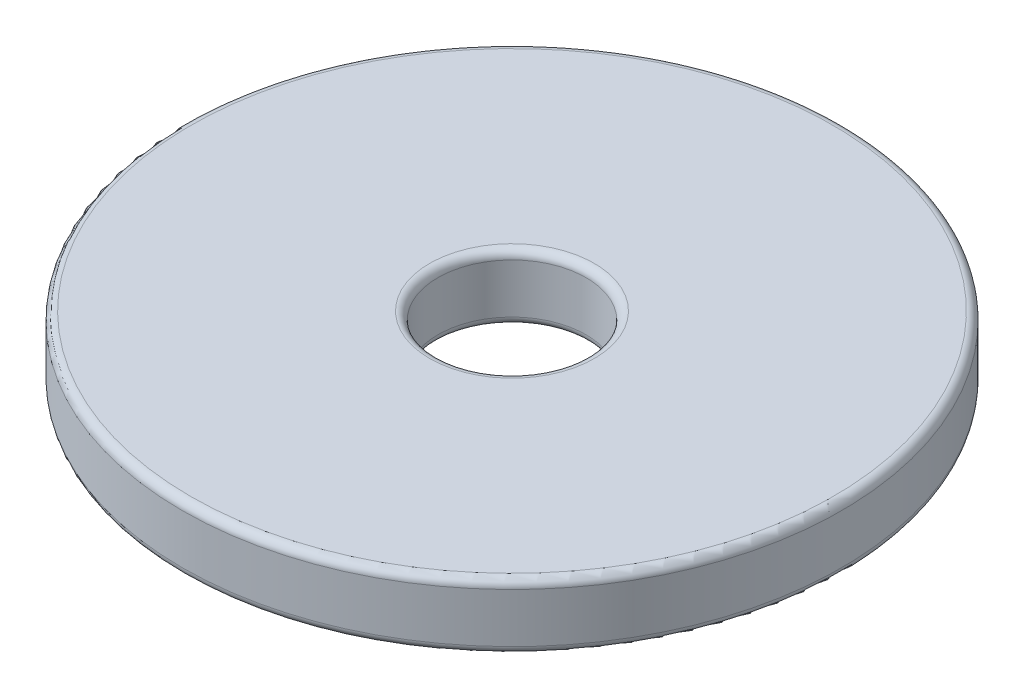
ISO-10303-21;
HEADER;
FILE_DESCRIPTION(('STEP AP214'),'2;1');
FILE_NAME('part.step','',(''),(''),'','','');
FILE_SCHEMA(('AUTOMOTIVE_DESIGN { 1 0 10303 214 1 1 1 1 }'));
ENDSEC;
DATA;
#1=APPLICATION_CONTEXT('core data for automotive mechanical design processes');
#2=APPLICATION_PROTOCOL_DEFINITION('international standard','automotive_design',2000,#1);
#3=PRODUCT_CONTEXT('',#1,'mechanical');
#4=PRODUCT('Part','Part','',(#3));
#5=PRODUCT_RELATED_PRODUCT_CATEGORY('part','',(#4));
#6=PRODUCT_DEFINITION_FORMATION('','',#4);
#7=PRODUCT_DEFINITION_CONTEXT('part definition',#1,'design');
#8=PRODUCT_DEFINITION('design','',#6,#7);
#9=PRODUCT_DEFINITION_SHAPE('','',#8);
#10=(LENGTH_UNIT() NAMED_UNIT(*) SI_UNIT(.MILLI.,.METRE.));
#11=(NAMED_UNIT(*) PLANE_ANGLE_UNIT() SI_UNIT($,.RADIAN.));
#12=(NAMED_UNIT(*) SI_UNIT($,.STERADIAN.) SOLID_ANGLE_UNIT());
#13=UNCERTAINTY_MEASURE_WITH_UNIT(LENGTH_MEASURE(1.E-05),#10,'distance_accuracy_value','');
#14=(GEOMETRIC_REPRESENTATION_CONTEXT(3) GLOBAL_UNCERTAINTY_ASSIGNED_CONTEXT((#13)) GLOBAL_UNIT_ASSIGNED_CONTEXT((#10,
#11,#12)) REPRESENTATION_CONTEXT('',''));
#15=CARTESIAN_POINT('',(0.,0.,0.));
#16=DIRECTION('',(0.,0.,1.));
#17=DIRECTION('',(1.,0.,0.));
#18=AXIS2_PLACEMENT_3D('',#15,#16,#17);
#19=CARTESIAN_POINT('',(0.,2.,0.));
#20=DIRECTION('',(0.,1.,0.));
#21=DIRECTION('',(0.,0.,1.));
#22=AXIS2_PLACEMENT_3D('',#19,#20,#21);
#23=PLANE('',#22);
#24=CARTESIAN_POINT('',(0.,2.,0.));
#25=DIRECTION('',(0.,1.,0.));
#26=DIRECTION('',(0.,0.,1.));
#27=AXIS2_PLACEMENT_3D('',#24,#25,#26);
#28=CIRCLE('',#27,2.5);
#29=CARTESIAN_POINT('',(0.,2.,2.5));
#30=VERTEX_POINT('',#29);
#31=EDGE_CURVE('E49',#30,#30,#28,.F.);
#32=ORIENTED_EDGE('',*,*,#31,.T.);
#33=EDGE_LOOP('',(#32));
#34=FACE_BOUND('',#33,.T.);
#35=CARTESIAN_POINT('',(0.,2.,0.));
#36=DIRECTION('',(0.,1.,0.));
#37=DIRECTION('',(0.,0.,1.));
#38=AXIS2_PLACEMENT_3D('',#35,#36,#37);
#39=CIRCLE('',#38,9.75);
#40=CARTESIAN_POINT('',(0.,2.,9.75));
#41=VERTEX_POINT('',#40);
#42=EDGE_CURVE('E54',#41,#41,#39,.T.);
#43=ORIENTED_EDGE('',*,*,#42,.T.);
#44=EDGE_LOOP('',(#43));
#45=FACE_BOUND('',#44,.T.);
#46=ADVANCED_FACE('F36',(#34,#45),#23,.T.);
#47=CARTESIAN_POINT('',(0.,0.,0.));
#48=DIRECTION('',(0.,1.,0.));
#49=DIRECTION('',(0.,0.,1.));
#50=AXIS2_PLACEMENT_3D('',#47,#48,#49);
#51=PLANE('',#50);
#52=CARTESIAN_POINT('',(0.,0.,0.));
#53=DIRECTION('',(0.,1.,0.));
#54=DIRECTION('',(0.,0.,1.));
#55=AXIS2_PLACEMENT_3D('',#52,#53,#54);
#56=CIRCLE('',#55,2.5);
#57=CARTESIAN_POINT('',(0.,0.,2.5));
#58=VERTEX_POINT('',#57);
#59=EDGE_CURVE('E68',#58,#58,#56,.T.);
#60=ORIENTED_EDGE('',*,*,#59,.T.);
#61=EDGE_LOOP('',(#60));
#62=FACE_BOUND('',#61,.T.);
#63=CARTESIAN_POINT('',(0.,0.,0.));
#64=DIRECTION('',(0.,1.,0.));
#65=DIRECTION('',(0.,0.,1.));
#66=AXIS2_PLACEMENT_3D('',#63,#64,#65);
#67=CIRCLE('',#66,9.75);
#68=CARTESIAN_POINT('',(0.,0.,9.75));
#69=VERTEX_POINT('',#68);
#70=EDGE_CURVE('E72',#69,#69,#67,.F.);
#71=ORIENTED_EDGE('',*,*,#70,.T.);
#72=EDGE_LOOP('',(#71));
#73=FACE_BOUND('',#72,.T.);
#74=ADVANCED_FACE('F77',(#62,#73),#51,.F.);
#75=CARTESIAN_POINT('',(0.,2.,0.));
#76=DIRECTION('',(0.,-1.,0.));
#77=DIRECTION('',(0.,0.,-1.));
#78=AXIS2_PLACEMENT_3D('',#75,#76,#77);
#79=CYLINDRICAL_SURFACE('',#78,10.);
#80=CARTESIAN_POINT('',(0.,0.25,0.));
#81=DIRECTION('',(0.,1.,0.));
#82=DIRECTION('',(0.,0.,1.));
#83=AXIS2_PLACEMENT_3D('',#80,#81,#82);
#84=CIRCLE('',#83,10.);
#85=CARTESIAN_POINT('',(0.,0.25,10.));
#86=VERTEX_POINT('',#85);
#87=EDGE_CURVE('E10',#86,#86,#84,.T.);
#88=ORIENTED_EDGE('',*,*,#87,.T.);
#89=EDGE_LOOP('',(#88));
#90=FACE_BOUND('',#89,.T.);
#91=CARTESIAN_POINT('',(0.,1.75,0.));
#92=DIRECTION('',(0.,1.,0.));
#93=DIRECTION('',(0.,0.,1.));
#94=AXIS2_PLACEMENT_3D('',#91,#92,#93);
#95=CIRCLE('',#94,10.);
#96=CARTESIAN_POINT('',(0.,1.75,10.));
#97=VERTEX_POINT('',#96);
#98=EDGE_CURVE('E44',#97,#97,#95,.F.);
#99=ORIENTED_EDGE('',*,*,#98,.T.);
#100=EDGE_LOOP('',(#99));
#101=FACE_BOUND('',#100,.T.);
#102=ADVANCED_FACE('F97',(#90,#101),#79,.T.);
#103=CARTESIAN_POINT('',(0.,2.,0.));
#104=DIRECTION('',(0.,-1.,0.));
#105=DIRECTION('',(0.,0.,-1.));
#106=AXIS2_PLACEMENT_3D('',#103,#104,#105);
#107=CYLINDRICAL_SURFACE('',#106,2.25);
#108=CARTESIAN_POINT('',(0.,0.25,0.));
#109=DIRECTION('',(0.,1.,0.));
#110=DIRECTION('',(0.,0.,1.));
#111=AXIS2_PLACEMENT_3D('',#108,#109,#110);
#112=CIRCLE('',#111,2.25);
#113=CARTESIAN_POINT('',(0.,0.25,2.25));
#114=VERTEX_POINT('',#113);
#115=EDGE_CURVE('E60',#114,#114,#112,.F.);
#116=ORIENTED_EDGE('',*,*,#115,.T.);
#117=EDGE_LOOP('',(#116));
#118=FACE_BOUND('',#117,.T.);
#119=CARTESIAN_POINT('',(0.,1.75,0.));
#120=DIRECTION('',(0.,1.,0.));
#121=DIRECTION('',(0.,0.,1.));
#122=AXIS2_PLACEMENT_3D('',#119,#120,#121);
#123=CIRCLE('',#122,2.25);
#124=CARTESIAN_POINT('',(0.,1.75,2.25));
#125=VERTEX_POINT('',#124);
#126=EDGE_CURVE('E64',#125,#125,#123,.T.);
#127=ORIENTED_EDGE('',*,*,#126,.T.);
#128=EDGE_LOOP('',(#127));
#129=FACE_BOUND('',#128,.T.);
#130=ADVANCED_FACE('F102',(#118,#129),#107,.F.);
#131=CARTESIAN_POINT('',(0.,0.25,0.));
#132=DIRECTION('',(0.,1.,0.));
#133=DIRECTION('',(0.,0.,1.));
#134=AXIS2_PLACEMENT_3D('',#131,#132,#133);
#135=TOROIDAL_SURFACE('',#134,2.5,0.25);
#136=ORIENTED_EDGE('',*,*,#115,.F.);
#137=EDGE_LOOP('',(#136));
#138=FACE_BOUND('',#137,.T.);
#139=ORIENTED_EDGE('',*,*,#59,.F.);
#140=EDGE_LOOP('',(#139));
#141=FACE_BOUND('',#140,.T.);
#142=ADVANCED_FACE('F88',(#138,#141),#135,.T.);
#143=CARTESIAN_POINT('',(0.,1.75,0.));
#144=DIRECTION('',(0.,1.,0.));
#145=DIRECTION('',(0.,0.,1.));
#146=AXIS2_PLACEMENT_3D('',#143,#144,#145);
#147=TOROIDAL_SURFACE('',#146,2.5,0.25);
#148=ORIENTED_EDGE('',*,*,#31,.F.);
#149=EDGE_LOOP('',(#148));
#150=FACE_BOUND('',#149,.T.);
#151=ORIENTED_EDGE('',*,*,#126,.F.);
#152=EDGE_LOOP('',(#151));
#153=FACE_BOUND('',#152,.T.);
#154=ADVANCED_FACE('F82',(#150,#153),#147,.T.);
#155=CARTESIAN_POINT('',(0.,0.25,0.));
#156=DIRECTION('',(0.,1.,0.));
#157=DIRECTION('',(0.,0.,1.));
#158=AXIS2_PLACEMENT_3D('',#155,#156,#157);
#159=TOROIDAL_SURFACE('',#158,9.75,0.25);
#160=ORIENTED_EDGE('',*,*,#70,.F.);
#161=EDGE_LOOP('',(#160));
#162=FACE_BOUND('',#161,.T.);
#163=ORIENTED_EDGE('',*,*,#87,.F.);
#164=EDGE_LOOP('',(#163));
#165=FACE_BOUND('',#164,.T.);
#166=ADVANCED_FACE('F79',(#162,#165),#159,.T.);
#167=CARTESIAN_POINT('',(0.,1.75,0.));
#168=DIRECTION('',(0.,1.,0.));
#169=DIRECTION('',(0.,0.,1.));
#170=AXIS2_PLACEMENT_3D('',#167,#168,#169);
#171=TOROIDAL_SURFACE('',#170,9.75,0.25);
#172=ORIENTED_EDGE('',*,*,#98,.F.);
#173=EDGE_LOOP('',(#172));
#174=FACE_BOUND('',#173,.T.);
#175=ORIENTED_EDGE('',*,*,#42,.F.);
#176=EDGE_LOOP('',(#175));
#177=FACE_BOUND('',#176,.T.);
#178=ADVANCED_FACE('F38',(#174,#177),#171,.T.);
#179=CLOSED_SHELL('',(#46,#74,#102,#130,#142,#154,#166,#178));
#180=MANIFOLD_SOLID_BREP('B2',#179);
#181=ADVANCED_BREP_SHAPE_REPRESENTATION('',(#18,#180),#14);
#182=SHAPE_DEFINITION_REPRESENTATION(#9,#181);
ENDSEC;
END-ISO-10303-21;
